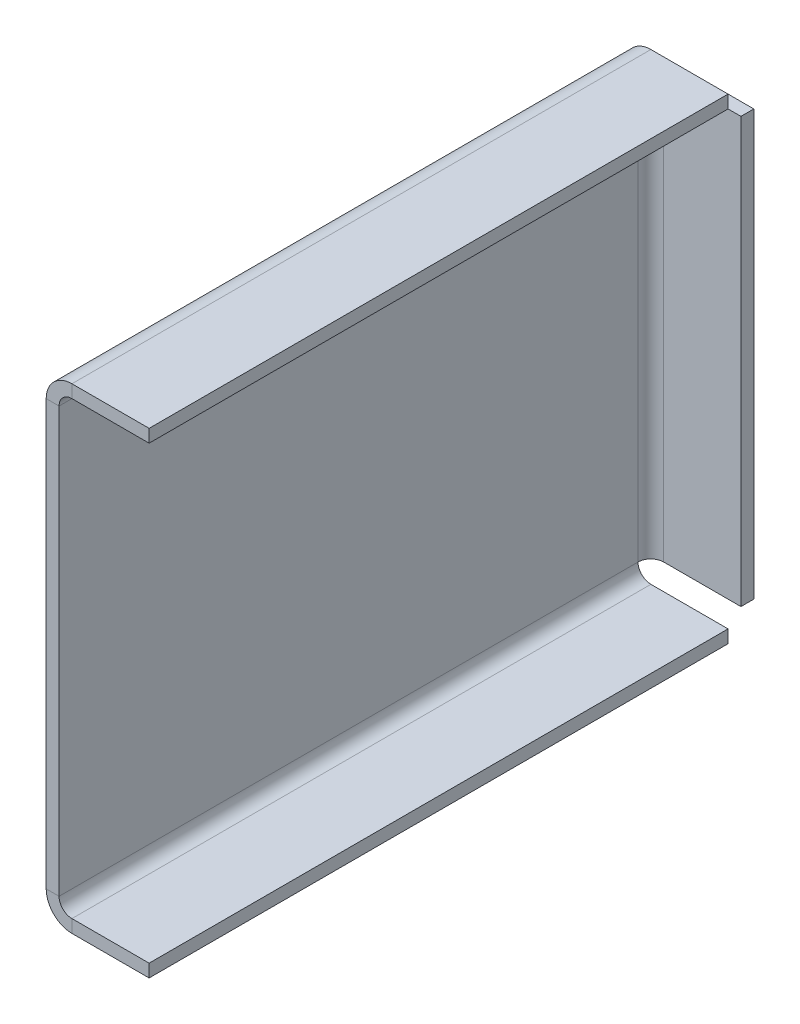
ISO-10303-21;
HEADER;
FILE_DESCRIPTION(('STEP AP214'),'2;1');
FILE_NAME('part.step','',(''),(''),'','','');
FILE_SCHEMA(('AUTOMOTIVE_DESIGN { 1 0 10303 214 1 1 1 1 }'));
ENDSEC;
DATA;
#1=APPLICATION_CONTEXT('core data for automotive mechanical design processes');
#2=APPLICATION_PROTOCOL_DEFINITION('international standard','automotive_design',2000,#1);
#3=PRODUCT_CONTEXT('',#1,'mechanical');
#4=PRODUCT('Part','Part','',(#3));
#5=PRODUCT_RELATED_PRODUCT_CATEGORY('part','',(#4));
#6=PRODUCT_DEFINITION_FORMATION('','',#4);
#7=PRODUCT_DEFINITION_CONTEXT('part definition',#1,'design');
#8=PRODUCT_DEFINITION('design','',#6,#7);
#9=PRODUCT_DEFINITION_SHAPE('','',#8);
#10=(LENGTH_UNIT() NAMED_UNIT(*) SI_UNIT(.MILLI.,.METRE.));
#11=(NAMED_UNIT(*) PLANE_ANGLE_UNIT() SI_UNIT($,.RADIAN.));
#12=(NAMED_UNIT(*) SI_UNIT($,.STERADIAN.) SOLID_ANGLE_UNIT());
#13=UNCERTAINTY_MEASURE_WITH_UNIT(LENGTH_MEASURE(1.E-05),#10,'distance_accuracy_value','');
#14=(GEOMETRIC_REPRESENTATION_CONTEXT(3) GLOBAL_UNCERTAINTY_ASSIGNED_CONTEXT((#13)) GLOBAL_UNIT_ASSIGNED_CONTEXT((#10,
#11,#12)) REPRESENTATION_CONTEXT('',''));
#15=CARTESIAN_POINT('',(0.,0.,0.));
#16=DIRECTION('',(0.,0.,1.));
#17=DIRECTION('',(1.,0.,0.));
#18=AXIS2_PLACEMENT_3D('',#15,#16,#17);
#19=CARTESIAN_POINT('',(0.,6.35,142.875));
#20=DIRECTION('',(0.,0.,1.));
#21=DIRECTION('',(1.,0.,0.));
#22=AXIS2_PLACEMENT_3D('',#19,#20,#21);
#23=PLANE('',#22);
#24=DIRECTION('',(1.,0.,0.));
#25=VECTOR('',#24,1.);
#26=CARTESIAN_POINT('',(0.,6.35,142.875));
#27=LINE('',#26,#25);
#28=CARTESIAN_POINT('',(0.,6.35,142.875));
#29=VERTEX_POINT('',#28);
#30=CARTESIAN_POINT('',(3.175,6.35,142.875));
#31=VERTEX_POINT('',#30);
#32=EDGE_CURVE('E13',#29,#31,#27,.T.);
#33=ORIENTED_EDGE('',*,*,#32,.F.);
#34=CARTESIAN_POINT('',(6.35,6.35,142.875));
#35=DIRECTION('',(0.,0.,1.));
#36=DIRECTION('',(1.,0.,0.));
#37=AXIS2_PLACEMENT_3D('',#34,#35,#36);
#38=CIRCLE('',#37,6.35);
#39=CARTESIAN_POINT('',(6.35,0.,142.875));
#40=VERTEX_POINT('',#39);
#41=EDGE_CURVE('E268',#40,#29,#38,.F.);
#42=ORIENTED_EDGE('',*,*,#41,.F.);
#43=DIRECTION('',(0.,-1.,0.));
#44=VECTOR('',#43,1.);
#45=CARTESIAN_POINT('',(6.35,3.175,142.875));
#46=LINE('',#45,#44);
#47=CARTESIAN_POINT('',(6.35,3.175,142.875));
#48=VERTEX_POINT('',#47);
#49=EDGE_CURVE('E65',#48,#40,#46,.T.);
#50=ORIENTED_EDGE('',*,*,#49,.F.);
#51=CARTESIAN_POINT('',(6.35,6.35,142.875));
#52=DIRECTION('',(0.,0.,1.));
#53=DIRECTION('',(1.,0.,0.));
#54=AXIS2_PLACEMENT_3D('',#51,#52,#53);
#55=CIRCLE('',#54,3.175);
#56=EDGE_CURVE('E167',#48,#31,#55,.F.);
#57=ORIENTED_EDGE('',*,*,#56,.T.);
#58=EDGE_LOOP('',(#33,#42,#50,#57));
#59=FACE_BOUND('',#58,.T.);
#60=ADVANCED_FACE('F57',(#59),#23,.T.);
#61=CARTESIAN_POINT('',(6.35,3.175,142.875));
#62=DIRECTION('',(0.,0.,1.));
#63=DIRECTION('',(1.,0.,0.));
#64=AXIS2_PLACEMENT_3D('',#61,#62,#63);
#65=PLANE('',#64);
#66=DIRECTION('',(0.,1.,0.));
#67=VECTOR('',#66,1.);
#68=CARTESIAN_POINT('',(0.,0.,142.875));
#69=LINE('',#68,#67);
#70=CARTESIAN_POINT('',(0.,111.125,142.875));
#71=VERTEX_POINT('',#70);
#72=EDGE_CURVE('E161',#29,#71,#69,.T.);
#73=ORIENTED_EDGE('',*,*,#72,.F.);
#74=ORIENTED_EDGE('',*,*,#32,.T.);
#75=DIRECTION('',(0.,1.,0.));
#76=VECTOR('',#75,1.);
#77=CARTESIAN_POINT('',(3.175,0.,142.875));
#78=LINE('',#77,#76);
#79=CARTESIAN_POINT('',(3.175,111.125,142.875));
#80=VERTEX_POINT('',#79);
#81=EDGE_CURVE('E159',#31,#80,#78,.T.);
#82=ORIENTED_EDGE('',*,*,#81,.T.);
#83=DIRECTION('',(-1.,0.,0.));
#84=VECTOR('',#83,1.);
#85=CARTESIAN_POINT('',(3.175,111.125,142.875));
#86=LINE('',#85,#84);
#87=EDGE_CURVE('E248',#80,#71,#86,.T.);
#88=ORIENTED_EDGE('',*,*,#87,.T.);
#89=EDGE_LOOP('',(#73,#74,#82,#88));
#90=FACE_BOUND('',#89,.T.);
#91=ADVANCED_FACE('F157',(#90),#65,.T.);
#92=CARTESIAN_POINT('',(6.35,0.,0.));
#93=DIRECTION('',(0.,0.,-1.));
#94=DIRECTION('',(-1.,0.,0.));
#95=AXIS2_PLACEMENT_3D('',#92,#93,#94);
#96=PLANE('',#95);
#97=DIRECTION('',(0.,1.,0.));
#98=VECTOR('',#97,1.);
#99=CARTESIAN_POINT('',(6.35,0.,0.));
#100=LINE('',#99,#98);
#101=CARTESIAN_POINT('',(6.35,0.,0.));
#102=VERTEX_POINT('',#101);
#103=CARTESIAN_POINT('',(6.35,3.175,0.));
#104=VERTEX_POINT('',#103);
#105=EDGE_CURVE('E254',#102,#104,#100,.T.);
#106=ORIENTED_EDGE('',*,*,#105,.F.);
#107=CARTESIAN_POINT('',(6.35,6.35,0.));
#108=DIRECTION('',(0.,0.,1.));
#109=DIRECTION('',(1.,0.,0.));
#110=AXIS2_PLACEMENT_3D('',#107,#108,#109);
#111=CIRCLE('',#110,6.35);
#112=CARTESIAN_POINT('',(0.,6.35,0.));
#113=VERTEX_POINT('',#112);
#114=EDGE_CURVE('E205',#102,#113,#111,.F.);
#115=ORIENTED_EDGE('',*,*,#114,.T.);
#116=DIRECTION('',(-1.,0.,0.));
#117=VECTOR('',#116,1.);
#118=CARTESIAN_POINT('',(3.175,6.35,0.));
#119=LINE('',#118,#117);
#120=CARTESIAN_POINT('',(3.175,6.35,0.));
#121=VERTEX_POINT('',#120);
#122=EDGE_CURVE('E251',#121,#113,#119,.T.);
#123=ORIENTED_EDGE('',*,*,#122,.F.);
#124=CARTESIAN_POINT('',(6.35,6.35,0.));
#125=DIRECTION('',(0.,0.,1.));
#126=DIRECTION('',(1.,0.,0.));
#127=AXIS2_PLACEMENT_3D('',#124,#125,#126);
#128=CIRCLE('',#127,3.175);
#129=EDGE_CURVE('E178',#104,#121,#128,.F.);
#130=ORIENTED_EDGE('',*,*,#129,.F.);
#131=EDGE_LOOP('',(#106,#115,#123,#130));
#132=FACE_BOUND('',#131,.T.);
#133=ADVANCED_FACE('F389',(#132),#96,.T.);
#134=CARTESIAN_POINT('',(3.175,6.35,0.));
#135=DIRECTION('',(0.,0.,-1.));
#136=DIRECTION('',(-1.,0.,0.));
#137=AXIS2_PLACEMENT_3D('',#134,#135,#136);
#138=PLANE('',#137);
#139=DIRECTION('',(-1.,0.,0.));
#140=VECTOR('',#139,1.);
#141=CARTESIAN_POINT('',(0.,0.,0.));
#142=LINE('',#141,#140);
#143=CARTESIAN_POINT('',(25.4,0.,0.));
#144=VERTEX_POINT('',#143);
#145=EDGE_CURVE('E208',#144,#102,#142,.T.);
#146=ORIENTED_EDGE('',*,*,#145,.T.);
#147=ORIENTED_EDGE('',*,*,#105,.T.);
#148=DIRECTION('',(1.,0.,0.));
#149=VECTOR('',#148,1.);
#150=CARTESIAN_POINT('',(0.,3.175,0.));
#151=LINE('',#150,#149);
#152=CARTESIAN_POINT('',(25.4,3.175,0.));
#153=VERTEX_POINT('',#152);
#154=EDGE_CURVE('E214',#153,#104,#151,.F.);
#155=ORIENTED_EDGE('',*,*,#154,.F.);
#156=DIRECTION('',(0.,-1.,0.));
#157=VECTOR('',#156,1.);
#158=CARTESIAN_POINT('',(25.4,3.175,0.));
#159=LINE('',#158,#157);
#160=EDGE_CURVE('E211',#153,#144,#159,.T.);
#161=ORIENTED_EDGE('',*,*,#160,.T.);
#162=EDGE_LOOP('',(#146,#147,#155,#161));
#163=FACE_BOUND('',#162,.T.);
#164=ADVANCED_FACE('F392',(#163),#138,.T.);
#165=CARTESIAN_POINT('',(6.35,117.475,142.875));
#166=DIRECTION('',(0.,0.,1.));
#167=DIRECTION('',(1.,0.,0.));
#168=AXIS2_PLACEMENT_3D('',#165,#166,#167);
#169=PLANE('',#168);
#170=DIRECTION('',(0.,-1.,0.));
#171=VECTOR('',#170,1.);
#172=CARTESIAN_POINT('',(6.35,117.475,142.875));
#173=LINE('',#172,#171);
#174=CARTESIAN_POINT('',(6.35,117.475,142.875));
#175=VERTEX_POINT('',#174);
#176=CARTESIAN_POINT('',(6.35,114.3,142.875));
#177=VERTEX_POINT('',#176);
#178=EDGE_CURVE('E73',#175,#177,#173,.T.);
#179=ORIENTED_EDGE('',*,*,#178,.F.);
#180=CARTESIAN_POINT('',(6.35,111.125,142.875));
#181=DIRECTION('',(0.,0.,1.));
#182=DIRECTION('',(1.,0.,0.));
#183=AXIS2_PLACEMENT_3D('',#180,#181,#182);
#184=CIRCLE('',#183,6.35);
#185=EDGE_CURVE('E278',#71,#175,#184,.F.);
#186=ORIENTED_EDGE('',*,*,#185,.F.);
#187=ORIENTED_EDGE('',*,*,#87,.F.);
#188=CARTESIAN_POINT('',(6.35,111.125,142.875));
#189=DIRECTION('',(0.,0.,1.));
#190=DIRECTION('',(1.,0.,0.));
#191=AXIS2_PLACEMENT_3D('',#188,#189,#190);
#192=CIRCLE('',#191,3.175);
#193=EDGE_CURVE('E184',#80,#177,#192,.F.);
#194=ORIENTED_EDGE('',*,*,#193,.T.);
#195=EDGE_LOOP('',(#179,#186,#187,#194));
#196=FACE_BOUND('',#195,.T.);
#197=ADVANCED_FACE('F417',(#196),#169,.T.);
#198=CARTESIAN_POINT('',(3.175,111.125,142.875));
#199=DIRECTION('',(0.,0.,1.));
#200=DIRECTION('',(1.,0.,0.));
#201=AXIS2_PLACEMENT_3D('',#198,#199,#200);
#202=PLANE('',#201);
#203=DIRECTION('',(1.,0.,0.));
#204=VECTOR('',#203,1.);
#205=CARTESIAN_POINT('',(0.,117.475,142.875));
#206=LINE('',#205,#204);
#207=CARTESIAN_POINT('',(25.4,117.475,142.875));
#208=VERTEX_POINT('',#207);
#209=EDGE_CURVE('E281',#175,#208,#206,.T.);
#210=ORIENTED_EDGE('',*,*,#209,.F.);
#211=ORIENTED_EDGE('',*,*,#178,.T.);
#212=DIRECTION('',(1.,0.,0.));
#213=VECTOR('',#212,1.);
#214=CARTESIAN_POINT('',(0.,114.3,142.875));
#215=LINE('',#214,#213);
#216=CARTESIAN_POINT('',(25.4,114.3,142.875));
#217=VERTEX_POINT('',#216);
#218=EDGE_CURVE('E126',#177,#217,#215,.T.);
#219=ORIENTED_EDGE('',*,*,#218,.T.);
#220=DIRECTION('',(0.,-1.,0.));
#221=VECTOR('',#220,1.);
#222=CARTESIAN_POINT('',(25.4,117.475,142.875));
#223=LINE('',#222,#221);
#224=EDGE_CURVE('E284',#208,#217,#223,.T.);
#225=ORIENTED_EDGE('',*,*,#224,.F.);
#226=EDGE_LOOP('',(#210,#211,#219,#225));
#227=FACE_BOUND('',#226,.T.);
#228=ADVANCED_FACE('F420',(#227),#202,.T.);
#229=CARTESIAN_POINT('',(0.,111.125,0.));
#230=DIRECTION('',(0.,0.,-1.));
#231=DIRECTION('',(-1.,0.,0.));
#232=AXIS2_PLACEMENT_3D('',#229,#230,#231);
#233=PLANE('',#232);
#234=DIRECTION('',(1.,0.,0.));
#235=VECTOR('',#234,1.);
#236=CARTESIAN_POINT('',(0.,111.125,0.));
#237=LINE('',#236,#235);
#238=CARTESIAN_POINT('',(0.,111.125,0.));
#239=VERTEX_POINT('',#238);
#240=CARTESIAN_POINT('',(3.175,111.125,0.));
#241=VERTEX_POINT('',#240);
#242=EDGE_CURVE('E245',#239,#241,#237,.T.);
#243=ORIENTED_EDGE('',*,*,#242,.F.);
#244=CARTESIAN_POINT('',(6.35,111.125,0.));
#245=DIRECTION('',(0.,0.,1.));
#246=DIRECTION('',(1.,0.,0.));
#247=AXIS2_PLACEMENT_3D('',#244,#245,#246);
#248=CIRCLE('',#247,6.35);
#249=CARTESIAN_POINT('',(6.35,117.475,0.));
#250=VERTEX_POINT('',#249);
#251=EDGE_CURVE('E200',#239,#250,#248,.F.);
#252=ORIENTED_EDGE('',*,*,#251,.T.);
#253=DIRECTION('',(0.,1.,0.));
#254=VECTOR('',#253,1.);
#255=CARTESIAN_POINT('',(6.35,114.3,0.));
#256=LINE('',#255,#254);
#257=CARTESIAN_POINT('',(6.35,114.3,0.));
#258=VERTEX_POINT('',#257);
#259=EDGE_CURVE('E120',#258,#250,#256,.T.);
#260=ORIENTED_EDGE('',*,*,#259,.F.);
#261=CARTESIAN_POINT('',(6.35,111.125,0.));
#262=DIRECTION('',(0.,0.,1.));
#263=DIRECTION('',(1.,0.,0.));
#264=AXIS2_PLACEMENT_3D('',#261,#262,#263);
#265=CIRCLE('',#264,3.175);
#266=EDGE_CURVE('E219',#241,#258,#265,.F.);
#267=ORIENTED_EDGE('',*,*,#266,.F.);
#268=EDGE_LOOP('',(#243,#252,#260,#267));
#269=FACE_BOUND('',#268,.T.);
#270=ADVANCED_FACE('F424',(#269),#233,.T.);
#271=CARTESIAN_POINT('',(0.,114.3,142.875));
#272=DIRECTION('',(0.,1.,0.));
#273=DIRECTION('',(0.,0.,1.));
#274=AXIS2_PLACEMENT_3D('',#271,#272,#273);
#275=PLANE('',#274);
#276=DIRECTION('',(1.,0.,0.));
#277=VECTOR('',#276,1.);
#278=CARTESIAN_POINT('',(0.,114.3,0.));
#279=LINE('',#278,#277);
#280=CARTESIAN_POINT('',(25.4,114.3,0.));
#281=VERTEX_POINT('',#280);
#282=EDGE_CURVE('E190',#258,#281,#279,.T.);
#283=ORIENTED_EDGE('',*,*,#282,.T.);
#284=DIRECTION('',(0.,0.,-1.));
#285=VECTOR('',#284,1.);
#286=CARTESIAN_POINT('',(25.4,114.3,142.875));
#287=LINE('',#286,#285);
#288=EDGE_CURVE('E242',#217,#281,#287,.T.);
#289=ORIENTED_EDGE('',*,*,#288,.F.);
#290=ORIENTED_EDGE('',*,*,#218,.F.);
#291=DIRECTION('',(0.,0.,-1.));
#292=VECTOR('',#291,1.);
#293=CARTESIAN_POINT('',(6.35,114.3,142.875));
#294=LINE('',#293,#292);
#295=EDGE_CURVE('E186',#177,#258,#294,.T.);
#296=ORIENTED_EDGE('',*,*,#295,.T.);
#297=EDGE_LOOP('',(#283,#289,#290,#296));
#298=FACE_BOUND('',#297,.T.);
#299=ADVANCED_FACE('F427',(#298),#275,.F.);
#300=CARTESIAN_POINT('',(25.4,117.475,142.875));
#301=DIRECTION('',(1.,0.,0.));
#302=DIRECTION('',(0.,0.,-1.));
#303=AXIS2_PLACEMENT_3D('',#300,#301,#302);
#304=PLANE('',#303);
#305=DIRECTION('',(0.,-1.,0.));
#306=VECTOR('',#305,1.);
#307=CARTESIAN_POINT('',(25.4,117.475,0.));
#308=LINE('',#307,#306);
#309=CARTESIAN_POINT('',(25.4,117.475,0.));
#310=VERTEX_POINT('',#309);
#311=EDGE_CURVE('E193',#310,#281,#308,.T.);
#312=ORIENTED_EDGE('',*,*,#311,.F.);
#313=DIRECTION('',(0.,0.,-1.));
#314=VECTOR('',#313,1.);
#315=CARTESIAN_POINT('',(25.4,117.475,142.875));
#316=LINE('',#315,#314);
#317=EDGE_CURVE('E240',#208,#310,#316,.T.);
#318=ORIENTED_EDGE('',*,*,#317,.F.);
#319=ORIENTED_EDGE('',*,*,#224,.T.);
#320=ORIENTED_EDGE('',*,*,#288,.T.);
#321=EDGE_LOOP('',(#312,#318,#319,#320));
#322=FACE_BOUND('',#321,.T.);
#323=ADVANCED_FACE('F430',(#322),#304,.T.);
#324=CARTESIAN_POINT('',(0.,117.475,142.875));
#325=DIRECTION('',(0.,1.,0.));
#326=DIRECTION('',(0.,0.,1.));
#327=AXIS2_PLACEMENT_3D('',#324,#325,#326);
#328=PLANE('',#327);
#329=DIRECTION('',(1.,0.,0.));
#330=VECTOR('',#329,1.);
#331=CARTESIAN_POINT('',(0.,117.475,0.));
#332=LINE('',#331,#330);
#333=EDGE_CURVE('E197',#250,#310,#332,.T.);
#334=ORIENTED_EDGE('',*,*,#333,.F.);
#335=DIRECTION('',(0.,0.,-1.));
#336=VECTOR('',#335,1.);
#337=CARTESIAN_POINT('',(6.35,117.475,142.875));
#338=LINE('',#337,#336);
#339=EDGE_CURVE('E237',#175,#250,#338,.T.);
#340=ORIENTED_EDGE('',*,*,#339,.F.);
#341=ORIENTED_EDGE('',*,*,#209,.T.);
#342=ORIENTED_EDGE('',*,*,#317,.T.);
#343=EDGE_LOOP('',(#334,#340,#341,#342));
#344=FACE_BOUND('',#343,.T.);
#345=ADVANCED_FACE('F434',(#344),#328,.T.);
#346=CARTESIAN_POINT('',(6.35,111.125,142.875));
#347=DIRECTION('',(0.,0.,-1.));
#348=DIRECTION('',(-1.,0.,0.));
#349=AXIS2_PLACEMENT_3D('',#346,#347,#348);
#350=CYLINDRICAL_SURFACE('',#349,6.35);
#351=ORIENTED_EDGE('',*,*,#251,.F.);
#352=DIRECTION('',(0.,0.,-1.));
#353=VECTOR('',#352,1.);
#354=CARTESIAN_POINT('',(0.,111.125,142.875));
#355=LINE('',#354,#353);
#356=EDGE_CURVE('E234',#71,#239,#355,.T.);
#357=ORIENTED_EDGE('',*,*,#356,.F.);
#358=ORIENTED_EDGE('',*,*,#185,.T.);
#359=ORIENTED_EDGE('',*,*,#339,.T.);
#360=EDGE_LOOP('',(#351,#357,#358,#359));
#361=FACE_BOUND('',#360,.T.);
#362=ADVANCED_FACE('F438',(#361),#350,.T.);
#363=CARTESIAN_POINT('',(0.,0.,142.875));
#364=DIRECTION('',(-1.,0.,0.));
#365=DIRECTION('',(0.,0.,1.));
#366=AXIS2_PLACEMENT_3D('',#363,#364,#365);
#367=PLANE('',#366);
#368=DIRECTION('',(0.,1.,0.));
#369=VECTOR('',#368,1.);
#370=CARTESIAN_POINT('',(0.,0.,0.));
#371=LINE('',#370,#369);
#372=EDGE_CURVE('E202',#113,#239,#371,.T.);
#373=ORIENTED_EDGE('',*,*,#372,.F.);
#374=DIRECTION('',(0.,0.,-1.));
#375=VECTOR('',#374,1.);
#376=CARTESIAN_POINT('',(0.,6.35,142.875));
#377=LINE('',#376,#375);
#378=EDGE_CURVE('E232',#29,#113,#377,.T.);
#379=ORIENTED_EDGE('',*,*,#378,.F.);
#380=ORIENTED_EDGE('',*,*,#72,.T.);
#381=ORIENTED_EDGE('',*,*,#356,.T.);
#382=EDGE_LOOP('',(#373,#379,#380,#381));
#383=FACE_BOUND('',#382,.T.);
#384=ADVANCED_FACE('F387',(#383),#367,.T.);
#385=CARTESIAN_POINT('',(6.35,6.35,142.875));
#386=DIRECTION('',(0.,0.,-1.));
#387=DIRECTION('',(-1.,0.,0.));
#388=AXIS2_PLACEMENT_3D('',#385,#386,#387);
#389=CYLINDRICAL_SURFACE('',#388,6.35);
#390=ORIENTED_EDGE('',*,*,#114,.F.);
#391=DIRECTION('',(0.,0.,-1.));
#392=VECTOR('',#391,1.);
#393=CARTESIAN_POINT('',(6.35,0.,142.875));
#394=LINE('',#393,#392);
#395=EDGE_CURVE('E229',#40,#102,#394,.T.);
#396=ORIENTED_EDGE('',*,*,#395,.F.);
#397=ORIENTED_EDGE('',*,*,#41,.T.);
#398=ORIENTED_EDGE('',*,*,#378,.T.);
#399=EDGE_LOOP('',(#390,#396,#397,#398));
#400=FACE_BOUND('',#399,.T.);
#401=ADVANCED_FACE('F267',(#400),#389,.T.);
#402=CARTESIAN_POINT('',(0.,0.,142.875));
#403=DIRECTION('',(0.,-1.,0.));
#404=DIRECTION('',(0.,0.,-1.));
#405=AXIS2_PLACEMENT_3D('',#402,#403,#404);
#406=PLANE('',#405);
#407=ORIENTED_EDGE('',*,*,#145,.F.);
#408=DIRECTION('',(0.,0.,-1.));
#409=VECTOR('',#408,1.);
#410=CARTESIAN_POINT('',(25.4,0.,142.875));
#411=LINE('',#410,#409);
#412=CARTESIAN_POINT('',(25.4,0.,142.875));
#413=VERTEX_POINT('',#412);
#414=EDGE_CURVE('E227',#413,#144,#411,.T.);
#415=ORIENTED_EDGE('',*,*,#414,.F.);
#416=DIRECTION('',(-1.,0.,0.));
#417=VECTOR('',#416,1.);
#418=CARTESIAN_POINT('',(0.,0.,142.875));
#419=LINE('',#418,#417);
#420=EDGE_CURVE('E261',#413,#40,#419,.T.);
#421=ORIENTED_EDGE('',*,*,#420,.T.);
#422=ORIENTED_EDGE('',*,*,#395,.T.);
#423=EDGE_LOOP('',(#407,#415,#421,#422));
#424=FACE_BOUND('',#423,.T.);
#425=ADVANCED_FACE('F272',(#424),#406,.T.);
#426=CARTESIAN_POINT('',(25.4,3.175,142.875));
#427=DIRECTION('',(1.,0.,0.));
#428=DIRECTION('',(0.,0.,-1.));
#429=AXIS2_PLACEMENT_3D('',#426,#427,#428);
#430=PLANE('',#429);
#431=ORIENTED_EDGE('',*,*,#160,.F.);
#432=DIRECTION('',(0.,0.,-1.));
#433=VECTOR('',#432,1.);
#434=CARTESIAN_POINT('',(25.4,3.175,142.875));
#435=LINE('',#434,#433);
#436=CARTESIAN_POINT('',(25.4,3.175,142.875));
#437=VERTEX_POINT('',#436);
#438=EDGE_CURVE('E225',#437,#153,#435,.T.);
#439=ORIENTED_EDGE('',*,*,#438,.F.);
#440=DIRECTION('',(0.,-1.,0.));
#441=VECTOR('',#440,1.);
#442=CARTESIAN_POINT('',(25.4,3.175,142.875));
#443=LINE('',#442,#441);
#444=EDGE_CURVE('E273',#437,#413,#443,.T.);
#445=ORIENTED_EDGE('',*,*,#444,.T.);
#446=ORIENTED_EDGE('',*,*,#414,.T.);
#447=EDGE_LOOP('',(#431,#439,#445,#446));
#448=FACE_BOUND('',#447,.T.);
#449=ADVANCED_FACE('F397',(#448),#430,.T.);
#450=CARTESIAN_POINT('',(0.,3.175,142.875));
#451=DIRECTION('',(0.,-1.,0.));
#452=DIRECTION('',(0.,0.,-1.));
#453=AXIS2_PLACEMENT_3D('',#450,#451,#452);
#454=PLANE('',#453);
#455=ORIENTED_EDGE('',*,*,#154,.T.);
#456=DIRECTION('',(0.,0.,-1.));
#457=VECTOR('',#456,1.);
#458=CARTESIAN_POINT('',(6.35,3.175,142.875));
#459=LINE('',#458,#457);
#460=EDGE_CURVE('E179',#48,#104,#459,.T.);
#461=ORIENTED_EDGE('',*,*,#460,.F.);
#462=DIRECTION('',(1.,0.,0.));
#463=VECTOR('',#462,1.);
#464=CARTESIAN_POINT('',(0.,3.175,142.875));
#465=LINE('',#464,#463);
#466=EDGE_CURVE('E172',#437,#48,#465,.F.);
#467=ORIENTED_EDGE('',*,*,#466,.F.);
#468=ORIENTED_EDGE('',*,*,#438,.T.);
#469=EDGE_LOOP('',(#455,#461,#467,#468));
#470=FACE_BOUND('',#469,.T.);
#471=ADVANCED_FACE('F395',(#470),#454,.F.);
#472=CARTESIAN_POINT('',(6.35,6.35,142.875));
#473=DIRECTION('',(0.,0.,-1.));
#474=DIRECTION('',(-1.,0.,0.));
#475=AXIS2_PLACEMENT_3D('',#472,#473,#474);
#476=CYLINDRICAL_SURFACE('',#475,3.175);
#477=ORIENTED_EDGE('',*,*,#129,.T.);
#478=DIRECTION('',(0.,0.,-1.));
#479=VECTOR('',#478,1.);
#480=CARTESIAN_POINT('',(3.175,6.35,142.875));
#481=LINE('',#480,#479);
#482=EDGE_CURVE('E175',#31,#121,#481,.T.);
#483=ORIENTED_EDGE('',*,*,#482,.F.);
#484=ORIENTED_EDGE('',*,*,#56,.F.);
#485=ORIENTED_EDGE('',*,*,#460,.T.);
#486=EDGE_LOOP('',(#477,#483,#484,#485));
#487=FACE_BOUND('',#486,.T.);
#488=ADVANCED_FACE('F176',(#487),#476,.F.);
#489=CARTESIAN_POINT('',(3.175,0.,142.875));
#490=DIRECTION('',(-1.,0.,0.));
#491=DIRECTION('',(0.,0.,1.));
#492=AXIS2_PLACEMENT_3D('',#489,#490,#491);
#493=PLANE('',#492);
#494=DIRECTION('',(0.,1.,0.));
#495=VECTOR('',#494,1.);
#496=CARTESIAN_POINT('',(3.175,0.,0.));
#497=LINE('',#496,#495);
#498=EDGE_CURVE('E113',#121,#241,#497,.T.);
#499=ORIENTED_EDGE('',*,*,#498,.T.);
#500=DIRECTION('',(0.,0.,-1.));
#501=VECTOR('',#500,1.);
#502=CARTESIAN_POINT('',(3.175,111.125,142.875));
#503=LINE('',#502,#501);
#504=EDGE_CURVE('E180',#80,#241,#503,.T.);
#505=ORIENTED_EDGE('',*,*,#504,.F.);
#506=ORIENTED_EDGE('',*,*,#81,.F.);
#507=ORIENTED_EDGE('',*,*,#482,.T.);
#508=EDGE_LOOP('',(#499,#505,#506,#507));
#509=FACE_BOUND('',#508,.T.);
#510=ADVANCED_FACE('F182',(#509),#493,.F.);
#511=CARTESIAN_POINT('',(6.35,111.125,142.875));
#512=DIRECTION('',(0.,0.,-1.));
#513=DIRECTION('',(-1.,0.,0.));
#514=AXIS2_PLACEMENT_3D('',#511,#512,#513);
#515=CYLINDRICAL_SURFACE('',#514,3.175);
#516=ORIENTED_EDGE('',*,*,#266,.T.);
#517=ORIENTED_EDGE('',*,*,#295,.F.);
#518=ORIENTED_EDGE('',*,*,#193,.F.);
#519=ORIENTED_EDGE('',*,*,#504,.T.);
#520=EDGE_LOOP('',(#516,#517,#518,#519));
#521=FACE_BOUND('',#520,.T.);
#522=ADVANCED_FACE('F484',(#521),#515,.F.);
#523=CARTESIAN_POINT('',(6.35,111.125,142.875));
#524=DIRECTION('',(0.,0.,1.));
#525=DIRECTION('',(1.,0.,0.));
#526=AXIS2_PLACEMENT_3D('',#523,#524,#525);
#527=PLANE('',#526);
#528=ORIENTED_EDGE('',*,*,#466,.T.);
#529=ORIENTED_EDGE('',*,*,#49,.T.);
#530=ORIENTED_EDGE('',*,*,#420,.F.);
#531=ORIENTED_EDGE('',*,*,#444,.F.);
#532=EDGE_LOOP('',(#528,#529,#530,#531));
#533=FACE_BOUND('',#532,.T.);
#534=ADVANCED_FACE('F258',(#533),#527,.T.);
#535=CARTESIAN_POINT('',(6.35,111.125,0.));
#536=DIRECTION('',(0.,0.,1.));
#537=DIRECTION('',(1.,0.,0.));
#538=AXIS2_PLACEMENT_3D('',#535,#536,#537);
#539=PLANE('',#538);
#540=ORIENTED_EDGE('',*,*,#282,.F.);
#541=ORIENTED_EDGE('',*,*,#259,.T.);
#542=ORIENTED_EDGE('',*,*,#333,.T.);
#543=ORIENTED_EDGE('',*,*,#311,.T.);
#544=EDGE_LOOP('',(#540,#541,#542,#543));
#545=FACE_BOUND('',#544,.T.);
#546=ADVANCED_FACE('F483',(#545),#539,.F.);
#547=CARTESIAN_POINT('',(6.34999999999999,6.34999999999999,0.));
#548=DIRECTION('',(0.,-1.,0.));
#549=DIRECTION('',(0.,0.,-1.));
#550=AXIS2_PLACEMENT_3D('',#547,#548,#549);
#551=PLANE('',#550);
#552=DIRECTION('',(0.,0.,1.));
#553=VECTOR('',#552,1.);
#554=CARTESIAN_POINT('',(6.34999999999999,6.35,-6.34999999999999));
#555=LINE('',#554,#553);
#556=CARTESIAN_POINT('',(6.34999999999998,6.34999999999999,-3.175));
#557=VERTEX_POINT('',#556);
#558=CARTESIAN_POINT('',(6.34999999999997,6.35,-6.35));
#559=VERTEX_POINT('',#558);
#560=EDGE_CURVE('E300',#557,#559,#555,.F.);
#561=ORIENTED_EDGE('',*,*,#560,.F.);
#562=CARTESIAN_POINT('',(6.34999999999999,6.34999999999999,0.));
#563=DIRECTION('',(0.,1.,0.));
#564=DIRECTION('',(0.,0.,1.));
#565=AXIS2_PLACEMENT_3D('',#562,#563,#564);
#566=CIRCLE('',#565,3.175);
#567=EDGE_CURVE('E291',#121,#557,#566,.F.);
#568=ORIENTED_EDGE('',*,*,#567,.F.);
#569=ORIENTED_EDGE('',*,*,#122,.T.);
#570=CARTESIAN_POINT('',(6.34999999999999,6.34999999999999,0.));
#571=DIRECTION('',(0.,1.,0.));
#572=DIRECTION('',(0.,0.,1.));
#573=AXIS2_PLACEMENT_3D('',#570,#571,#572);
#574=CIRCLE('',#573,6.35);
#575=EDGE_CURVE('E194',#113,#559,#574,.F.);
#576=ORIENTED_EDGE('',*,*,#575,.T.);
#577=EDGE_LOOP('',(#561,#568,#569,#576));
#578=FACE_BOUND('',#577,.T.);
#579=ADVANCED_FACE('F380',(#578),#551,.T.);
#580=CARTESIAN_POINT('',(6.34999999999999,111.125,0.));
#581=DIRECTION('',(0.,-1.,0.));
#582=DIRECTION('',(0.,0.,-1.));
#583=AXIS2_PLACEMENT_3D('',#580,#581,#582);
#584=PLANE('',#583);
#585=CARTESIAN_POINT('',(6.34999999999999,111.125,0.));
#586=DIRECTION('',(0.,1.,0.));
#587=DIRECTION('',(0.,0.,1.));
#588=AXIS2_PLACEMENT_3D('',#585,#586,#587);
#589=CIRCLE('',#588,3.175);
#590=CARTESIAN_POINT('',(6.34999999999998,111.125,-3.17499999999999));
#591=VERTEX_POINT('',#590);
#592=EDGE_CURVE('E288',#591,#241,#589,.T.);
#593=ORIENTED_EDGE('',*,*,#592,.F.);
#594=DIRECTION('',(0.,0.,1.));
#595=VECTOR('',#594,1.);
#596=CARTESIAN_POINT('',(6.34999999999999,111.125,-3.175));
#597=LINE('',#596,#595);
#598=CARTESIAN_POINT('',(6.34999999999999,111.125,-6.35));
#599=VERTEX_POINT('',#598);
#600=EDGE_CURVE('E306',#591,#599,#597,.F.);
#601=ORIENTED_EDGE('',*,*,#600,.T.);
#602=CARTESIAN_POINT('',(6.34999999999999,111.125,0.));
#603=DIRECTION('',(0.,1.,0.));
#604=DIRECTION('',(0.,0.,1.));
#605=AXIS2_PLACEMENT_3D('',#602,#603,#604);
#606=CIRCLE('',#605,6.35);
#607=EDGE_CURVE('E295',#599,#239,#606,.T.);
#608=ORIENTED_EDGE('',*,*,#607,.T.);
#609=ORIENTED_EDGE('',*,*,#242,.T.);
#610=EDGE_LOOP('',(#593,#601,#608,#609));
#611=FACE_BOUND('',#610,.T.);
#612=ADVANCED_FACE('F376',(#611),#584,.F.);
#613=CARTESIAN_POINT('',(6.34999999999999,111.125,0.));
#614=DIRECTION('',(0.,1.,0.));
#615=DIRECTION('',(0.,0.,-1.));
#616=AXIS2_PLACEMENT_3D('',#613,#614,#615);
#617=CYLINDRICAL_SURFACE('',#616,6.35);
#618=ORIENTED_EDGE('',*,*,#372,.T.);
#619=ORIENTED_EDGE('',*,*,#607,.F.);
#620=DIRECTION('',(0.,1.,0.));
#621=VECTOR('',#620,1.);
#622=CARTESIAN_POINT('',(6.34999999999999,6.35,-6.35));
#623=LINE('',#622,#621);
#624=EDGE_CURVE('E309',#599,#559,#623,.F.);
#625=ORIENTED_EDGE('',*,*,#624,.T.);
#626=ORIENTED_EDGE('',*,*,#575,.F.);
#627=EDGE_LOOP('',(#618,#619,#625,#626));
#628=FACE_BOUND('',#627,.T.);
#629=ADVANCED_FACE('F384',(#628),#617,.T.);
#630=CARTESIAN_POINT('',(6.34999999999999,111.125,0.));
#631=DIRECTION('',(0.,1.,0.));
#632=DIRECTION('',(0.,0.,-1.));
#633=AXIS2_PLACEMENT_3D('',#630,#631,#632);
#634=CYLINDRICAL_SURFACE('',#633,3.175);
#635=ORIENTED_EDGE('',*,*,#498,.F.);
#636=ORIENTED_EDGE('',*,*,#567,.T.);
#637=DIRECTION('',(0.,1.,0.));
#638=VECTOR('',#637,1.);
#639=CARTESIAN_POINT('',(6.34999999999999,6.35,-3.175));
#640=LINE('',#639,#638);
#641=EDGE_CURVE('E303',#557,#591,#640,.T.);
#642=ORIENTED_EDGE('',*,*,#641,.T.);
#643=ORIENTED_EDGE('',*,*,#592,.T.);
#644=EDGE_LOOP('',(#635,#636,#642,#643));
#645=FACE_BOUND('',#644,.T.);
#646=ADVANCED_FACE('F379',(#645),#634,.F.);
#647=CARTESIAN_POINT('',(3.17499999999999,6.35,-6.34999999999999));
#648=DIRECTION('',(0.,1.,0.));
#649=DIRECTION('',(-1.,0.,0.));
#650=AXIS2_PLACEMENT_3D('',#647,#648,#649);
#651=PLANE('',#650);
#652=ORIENTED_EDGE('',*,*,#560,.T.);
#653=DIRECTION('',(-1.,0.,0.));
#654=VECTOR('',#653,1.);
#655=CARTESIAN_POINT('',(0.,6.35,-6.34999999999998));
#656=LINE('',#655,#654);
#657=CARTESIAN_POINT('',(25.4,6.35,-6.35000000000007));
#658=VERTEX_POINT('',#657);
#659=EDGE_CURVE('E321',#658,#559,#656,.T.);
#660=ORIENTED_EDGE('',*,*,#659,.F.);
#661=DIRECTION('',(0.,0.,1.));
#662=VECTOR('',#661,1.);
#663=CARTESIAN_POINT('',(25.4,6.35,-6.35000000000007));
#664=LINE('',#663,#662);
#665=CARTESIAN_POINT('',(25.4,6.35,-3.17500000000007));
#666=VERTEX_POINT('',#665);
#667=EDGE_CURVE('E330',#658,#666,#664,.T.);
#668=ORIENTED_EDGE('',*,*,#667,.T.);
#669=DIRECTION('',(1.,0.,0.));
#670=VECTOR('',#669,1.);
#671=CARTESIAN_POINT('',(3.175,6.35,-3.17499999999999));
#672=LINE('',#671,#670);
#673=EDGE_CURVE('E312',#666,#557,#672,.F.);
#674=ORIENTED_EDGE('',*,*,#673,.T.);
#675=EDGE_LOOP('',(#652,#660,#668,#674));
#676=FACE_BOUND('',#675,.T.);
#677=ADVANCED_FACE('F355',(#676),#651,.F.);
#678=CARTESIAN_POINT('',(25.4,111.125,-6.35000000000007));
#679=DIRECTION('',(0.,-1.,0.));
#680=DIRECTION('',(0.,0.,-1.));
#681=AXIS2_PLACEMENT_3D('',#678,#679,#680);
#682=PLANE('',#681);
#683=ORIENTED_EDGE('',*,*,#600,.F.);
#684=DIRECTION('',(-1.,0.,0.));
#685=VECTOR('',#684,1.);
#686=CARTESIAN_POINT('',(25.4,111.125,-3.17500000000007));
#687=LINE('',#686,#685);
#688=CARTESIAN_POINT('',(25.4,111.125,-3.17500000000007));
#689=VERTEX_POINT('',#688);
#690=EDGE_CURVE('E315',#591,#689,#687,.F.);
#691=ORIENTED_EDGE('',*,*,#690,.T.);
#692=DIRECTION('',(0.,0.,1.));
#693=VECTOR('',#692,1.);
#694=CARTESIAN_POINT('',(25.4,111.125,-6.35000000000007));
#695=LINE('',#694,#693);
#696=CARTESIAN_POINT('',(25.4,111.125,-6.35000000000007));
#697=VERTEX_POINT('',#696);
#698=EDGE_CURVE('E292',#697,#689,#695,.T.);
#699=ORIENTED_EDGE('',*,*,#698,.F.);
#700=DIRECTION('',(1.,0.,0.));
#701=VECTOR('',#700,1.);
#702=CARTESIAN_POINT('',(0.,111.125,-6.34999999999998));
#703=LINE('',#702,#701);
#704=EDGE_CURVE('E324',#599,#697,#703,.T.);
#705=ORIENTED_EDGE('',*,*,#704,.F.);
#706=EDGE_LOOP('',(#683,#691,#699,#705));
#707=FACE_BOUND('',#706,.T.);
#708=ADVANCED_FACE('F373',(#707),#682,.F.);
#709=CARTESIAN_POINT('',(0.,0.,-6.34999999999998));
#710=DIRECTION('',(0.,0.,1.));
#711=DIRECTION('',(1.,0.,0.));
#712=AXIS2_PLACEMENT_3D('',#709,#710,#711);
#713=PLANE('',#712);
#714=ORIENTED_EDGE('',*,*,#624,.F.);
#715=ORIENTED_EDGE('',*,*,#704,.T.);
#716=DIRECTION('',(0.,-1.,0.));
#717=VECTOR('',#716,1.);
#718=CARTESIAN_POINT('',(25.4,0.,-6.35000000000007));
#719=LINE('',#718,#717);
#720=EDGE_CURVE('E327',#697,#658,#719,.T.);
#721=ORIENTED_EDGE('',*,*,#720,.T.);
#722=ORIENTED_EDGE('',*,*,#659,.T.);
#723=EDGE_LOOP('',(#714,#715,#721,#722));
#724=FACE_BOUND('',#723,.T.);
#725=ADVANCED_FACE('F371',(#724),#713,.F.);
#726=CARTESIAN_POINT('',(0.,0.,-3.17499999999998));
#727=DIRECTION('',(0.,0.,1.));
#728=DIRECTION('',(1.,0.,0.));
#729=AXIS2_PLACEMENT_3D('',#726,#727,#728);
#730=PLANE('',#729);
#731=ORIENTED_EDGE('',*,*,#690,.F.);
#732=ORIENTED_EDGE('',*,*,#641,.F.);
#733=ORIENTED_EDGE('',*,*,#673,.F.);
#734=DIRECTION('',(0.,1.,0.));
#735=VECTOR('',#734,1.);
#736=CARTESIAN_POINT('',(25.4,6.35,-3.17500000000007));
#737=LINE('',#736,#735);
#738=EDGE_CURVE('E318',#689,#666,#737,.F.);
#739=ORIENTED_EDGE('',*,*,#738,.F.);
#740=EDGE_LOOP('',(#731,#732,#733,#739));
#741=FACE_BOUND('',#740,.T.);
#742=ADVANCED_FACE('F350',(#741),#730,.T.);
#743=CARTESIAN_POINT('',(25.4,6.35,-6.35000000000007));
#744=DIRECTION('',(-1.,0.,0.));
#745=DIRECTION('',(0.,0.,1.));
#746=AXIS2_PLACEMENT_3D('',#743,#744,#745);
#747=PLANE('',#746);
#748=ORIENTED_EDGE('',*,*,#738,.T.);
#749=ORIENTED_EDGE('',*,*,#667,.F.);
#750=ORIENTED_EDGE('',*,*,#720,.F.);
#751=ORIENTED_EDGE('',*,*,#698,.T.);
#752=EDGE_LOOP('',(#748,#749,#750,#751));
#753=FACE_BOUND('',#752,.T.);
#754=ADVANCED_FACE('F339',(#753),#747,.F.);
#755=CLOSED_SHELL('',(#60,#91,#133,#164,#197,#228,#270,#299,#323,#345,#362,#384,#401,#425,#449,
#471,#488,#510,#522,#534,#546,#579,#612,#629,#646,#677,#708,#725,#742,#754));
#756=MANIFOLD_SOLID_BREP('B2',#755);
#757=ADVANCED_BREP_SHAPE_REPRESENTATION('',(#18,#756),#14);
#758=SHAPE_DEFINITION_REPRESENTATION(#9,#757);
ENDSEC;
END-ISO-10303-21;
